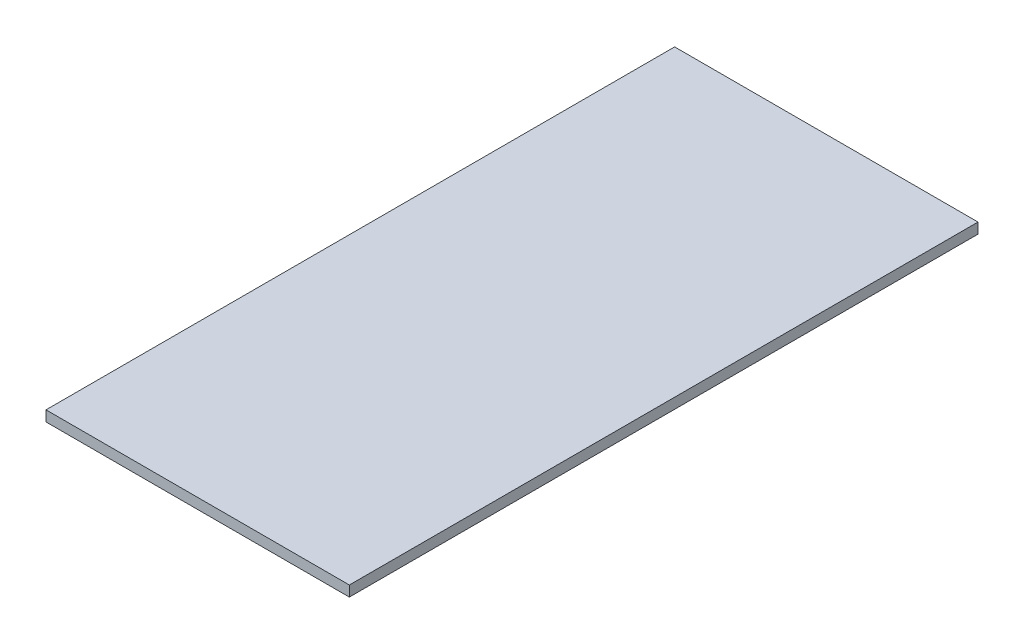
ISO-10303-21;
HEADER;
FILE_DESCRIPTION(('STEP AP214'),'2;1');
FILE_NAME('part.step','',(''),(''),'','','');
FILE_SCHEMA(('AUTOMOTIVE_DESIGN { 1 0 10303 214 1 1 1 1 }'));
ENDSEC;
DATA;
#1=APPLICATION_CONTEXT('core data for automotive mechanical design processes');
#2=APPLICATION_PROTOCOL_DEFINITION('international standard','automotive_design',2000,#1);
#3=PRODUCT_CONTEXT('',#1,'mechanical');
#4=PRODUCT('Part','Part','',(#3));
#5=PRODUCT_RELATED_PRODUCT_CATEGORY('part','',(#4));
#6=PRODUCT_DEFINITION_FORMATION('','',#4);
#7=PRODUCT_DEFINITION_CONTEXT('part definition',#1,'design');
#8=PRODUCT_DEFINITION('design','',#6,#7);
#9=PRODUCT_DEFINITION_SHAPE('','',#8);
#10=(LENGTH_UNIT() NAMED_UNIT(*) SI_UNIT(.MILLI.,.METRE.));
#11=(NAMED_UNIT(*) PLANE_ANGLE_UNIT() SI_UNIT($,.RADIAN.));
#12=(NAMED_UNIT(*) SI_UNIT($,.STERADIAN.) SOLID_ANGLE_UNIT());
#13=UNCERTAINTY_MEASURE_WITH_UNIT(LENGTH_MEASURE(1.E-05),#10,'distance_accuracy_value','');
#14=(GEOMETRIC_REPRESENTATION_CONTEXT(3) GLOBAL_UNCERTAINTY_ASSIGNED_CONTEXT((#13)) GLOBAL_UNIT_ASSIGNED_CONTEXT((#10,
#11,#12)) REPRESENTATION_CONTEXT('',''));
#15=CARTESIAN_POINT('',(0.,0.,0.));
#16=DIRECTION('',(0.,0.,1.));
#17=DIRECTION('',(1.,0.,0.));
#18=AXIS2_PLACEMENT_3D('',#15,#16,#17);
#19=CARTESIAN_POINT('',(288.7,10.,1196.5));
#20=DIRECTION('',(-1.,0.,0.));
#21=DIRECTION('',(0.,0.,1.));
#22=AXIS2_PLACEMENT_3D('',#19,#20,#21);
#23=PLANE('',#22);
#24=DIRECTION('',(0.,1.,0.));
#25=VECTOR('',#24,1.);
#26=CARTESIAN_POINT('',(288.7,10.,0.));
#27=LINE('',#26,#25);
#28=CARTESIAN_POINT('',(288.7,-10.,0.));
#29=VERTEX_POINT('',#28);
#30=CARTESIAN_POINT('',(288.7,10.,0.));
#31=VERTEX_POINT('',#30);
#32=EDGE_CURVE('E107',#29,#31,#27,.T.);
#33=ORIENTED_EDGE('',*,*,#32,.T.);
#34=DIRECTION('',(0.,0.,-1.));
#35=VECTOR('',#34,1.);
#36=CARTESIAN_POINT('',(288.7,10.,1196.5));
#37=LINE('',#36,#35);
#38=CARTESIAN_POINT('',(288.7,10.,1196.5));
#39=VERTEX_POINT('',#38);
#40=EDGE_CURVE('E11',#39,#31,#37,.T.);
#41=ORIENTED_EDGE('',*,*,#40,.F.);
#42=DIRECTION('',(0.,1.,0.));
#43=VECTOR('',#42,1.);
#44=CARTESIAN_POINT('',(288.7,10.,1196.5));
#45=LINE('',#44,#43);
#46=CARTESIAN_POINT('',(288.7,-10.,1196.5));
#47=VERTEX_POINT('',#46);
#48=EDGE_CURVE('E95',#47,#39,#45,.T.);
#49=ORIENTED_EDGE('',*,*,#48,.F.);
#50=DIRECTION('',(0.,0.,-1.));
#51=VECTOR('',#50,1.);
#52=CARTESIAN_POINT('',(288.7,-10.,1196.5));
#53=LINE('',#52,#51);
#54=EDGE_CURVE('E103',#47,#29,#53,.T.);
#55=ORIENTED_EDGE('',*,*,#54,.T.);
#56=EDGE_LOOP('',(#33,#41,#49,#55));
#57=FACE_BOUND('',#56,.T.);
#58=ADVANCED_FACE('F44',(#57),#23,.F.);
#59=CARTESIAN_POINT('',(-288.7,10.,1196.5));
#60=DIRECTION('',(0.,-1.,0.));
#61=DIRECTION('',(0.,0.,-1.));
#62=AXIS2_PLACEMENT_3D('',#59,#60,#61);
#63=PLANE('',#62);
#64=DIRECTION('',(-1.,0.,0.));
#65=VECTOR('',#64,1.);
#66=CARTESIAN_POINT('',(-288.7,10.,0.));
#67=LINE('',#66,#65);
#68=CARTESIAN_POINT('',(-288.7,10.,0.));
#69=VERTEX_POINT('',#68);
#70=EDGE_CURVE('E99',#31,#69,#67,.T.);
#71=ORIENTED_EDGE('',*,*,#70,.T.);
#72=DIRECTION('',(0.,0.,-1.));
#73=VECTOR('',#72,1.);
#74=CARTESIAN_POINT('',(-288.7,10.,1196.5));
#75=LINE('',#74,#73);
#76=CARTESIAN_POINT('',(-288.7,10.,1196.5));
#77=VERTEX_POINT('',#76);
#78=EDGE_CURVE('E52',#77,#69,#75,.T.);
#79=ORIENTED_EDGE('',*,*,#78,.F.);
#80=DIRECTION('',(-1.,0.,0.));
#81=VECTOR('',#80,1.);
#82=CARTESIAN_POINT('',(-288.7,10.,1196.5));
#83=LINE('',#82,#81);
#84=EDGE_CURVE('E90',#39,#77,#83,.T.);
#85=ORIENTED_EDGE('',*,*,#84,.F.);
#86=ORIENTED_EDGE('',*,*,#40,.T.);
#87=EDGE_LOOP('',(#71,#79,#85,#86));
#88=FACE_BOUND('',#87,.T.);
#89=ADVANCED_FACE('F98',(#88),#63,.F.);
#90=CARTESIAN_POINT('',(-288.7,10.,1196.5));
#91=DIRECTION('',(1.,0.,0.));
#92=DIRECTION('',(0.,0.,-1.));
#93=AXIS2_PLACEMENT_3D('',#90,#91,#92);
#94=PLANE('',#93);
#95=DIRECTION('',(0.,-1.,0.));
#96=VECTOR('',#95,1.);
#97=CARTESIAN_POINT('',(-288.7,10.,0.));
#98=LINE('',#97,#96);
#99=CARTESIAN_POINT('',(-288.7,-10.,0.));
#100=VERTEX_POINT('',#99);
#101=EDGE_CURVE('E77',#69,#100,#98,.T.);
#102=ORIENTED_EDGE('',*,*,#101,.T.);
#103=DIRECTION('',(0.,0.,-1.));
#104=VECTOR('',#103,1.);
#105=CARTESIAN_POINT('',(-288.7,-10.,1196.5));
#106=LINE('',#105,#104);
#107=CARTESIAN_POINT('',(-288.7,-10.,1196.5));
#108=VERTEX_POINT('',#107);
#109=EDGE_CURVE('E100',#108,#100,#106,.T.);
#110=ORIENTED_EDGE('',*,*,#109,.F.);
#111=DIRECTION('',(0.,-1.,0.));
#112=VECTOR('',#111,1.);
#113=CARTESIAN_POINT('',(-288.7,10.,1196.5));
#114=LINE('',#113,#112);
#115=EDGE_CURVE('E93',#77,#108,#114,.T.);
#116=ORIENTED_EDGE('',*,*,#115,.F.);
#117=ORIENTED_EDGE('',*,*,#78,.T.);
#118=EDGE_LOOP('',(#102,#110,#116,#117));
#119=FACE_BOUND('',#118,.T.);
#120=ADVANCED_FACE('F101',(#119),#94,.F.);
#121=CARTESIAN_POINT('',(-288.7,-10.,1196.5));
#122=DIRECTION('',(0.,1.,0.));
#123=DIRECTION('',(0.,0.,1.));
#124=AXIS2_PLACEMENT_3D('',#121,#122,#123);
#125=PLANE('',#124);
#126=DIRECTION('',(1.,0.,0.));
#127=VECTOR('',#126,1.);
#128=CARTESIAN_POINT('',(-288.7,-10.,0.));
#129=LINE('',#128,#127);
#130=EDGE_CURVE('E83',#100,#29,#129,.T.);
#131=ORIENTED_EDGE('',*,*,#130,.T.);
#132=ORIENTED_EDGE('',*,*,#54,.F.);
#133=DIRECTION('',(1.,0.,0.));
#134=VECTOR('',#133,1.);
#135=CARTESIAN_POINT('',(-288.7,-10.,1196.5));
#136=LINE('',#135,#134);
#137=EDGE_CURVE('E60',#108,#47,#136,.T.);
#138=ORIENTED_EDGE('',*,*,#137,.F.);
#139=ORIENTED_EDGE('',*,*,#109,.T.);
#140=EDGE_LOOP('',(#131,#132,#138,#139));
#141=FACE_BOUND('',#140,.T.);
#142=ADVANCED_FACE('F114',(#141),#125,.F.);
#143=CARTESIAN_POINT('',(0.,0.,1196.5));
#144=DIRECTION('',(0.,0.,1.));
#145=DIRECTION('',(1.,0.,0.));
#146=AXIS2_PLACEMENT_3D('',#143,#144,#145);
#147=PLANE('',#146);
#148=ORIENTED_EDGE('',*,*,#48,.T.);
#149=ORIENTED_EDGE('',*,*,#84,.T.);
#150=ORIENTED_EDGE('',*,*,#115,.T.);
#151=ORIENTED_EDGE('',*,*,#137,.T.);
#152=EDGE_LOOP('',(#148,#149,#150,#151));
#153=FACE_BOUND('',#152,.T.);
#154=ADVANCED_FACE('F91',(#153),#147,.T.);
#155=CARTESIAN_POINT('',(0.,0.,0.));
#156=DIRECTION('',(0.,0.,1.));
#157=DIRECTION('',(1.,0.,0.));
#158=AXIS2_PLACEMENT_3D('',#155,#156,#157);
#159=PLANE('',#158);
#160=ORIENTED_EDGE('',*,*,#32,.F.);
#161=ORIENTED_EDGE('',*,*,#130,.F.);
#162=ORIENTED_EDGE('',*,*,#101,.F.);
#163=ORIENTED_EDGE('',*,*,#70,.F.);
#164=EDGE_LOOP('',(#160,#161,#162,#163));
#165=FACE_BOUND('',#164,.T.);
#166=ADVANCED_FACE('F117',(#165),#159,.F.);
#167=CLOSED_SHELL('',(#58,#89,#120,#142,#154,#166));
#168=MANIFOLD_SOLID_BREP('B2',#167);
#169=ADVANCED_BREP_SHAPE_REPRESENTATION('',(#18,#168),#14);
#170=SHAPE_DEFINITION_REPRESENTATION(#9,#169);
ENDSEC;
END-ISO-10303-21;
